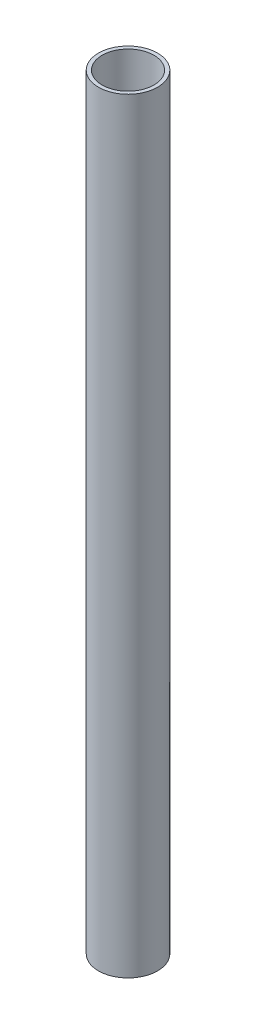
ISO-10303-21;
HEADER;
FILE_DESCRIPTION(('STEP AP214'),'2;1');
FILE_NAME('part.step','',(''),(''),'','','');
FILE_SCHEMA(('AUTOMOTIVE_DESIGN { 1 0 10303 214 1 1 1 1 }'));
ENDSEC;
DATA;
#1=APPLICATION_CONTEXT('core data for automotive mechanical design processes');
#2=APPLICATION_PROTOCOL_DEFINITION('international standard','automotive_design',2000,#1);
#3=PRODUCT_CONTEXT('',#1,'mechanical');
#4=PRODUCT('Part','Part','',(#3));
#5=PRODUCT_RELATED_PRODUCT_CATEGORY('part','',(#4));
#6=PRODUCT_DEFINITION_FORMATION('','',#4);
#7=PRODUCT_DEFINITION_CONTEXT('part definition',#1,'design');
#8=PRODUCT_DEFINITION('design','',#6,#7);
#9=PRODUCT_DEFINITION_SHAPE('','',#8);
#10=(LENGTH_UNIT() NAMED_UNIT(*) SI_UNIT(.MILLI.,.METRE.));
#11=(NAMED_UNIT(*) PLANE_ANGLE_UNIT() SI_UNIT($,.RADIAN.));
#12=(NAMED_UNIT(*) SI_UNIT($,.STERADIAN.) SOLID_ANGLE_UNIT());
#13=UNCERTAINTY_MEASURE_WITH_UNIT(LENGTH_MEASURE(1.E-05),#10,'distance_accuracy_value','');
#14=(GEOMETRIC_REPRESENTATION_CONTEXT(3) GLOBAL_UNCERTAINTY_ASSIGNED_CONTEXT((#13)) GLOBAL_UNIT_ASSIGNED_CONTEXT((#10,
#11,#12)) REPRESENTATION_CONTEXT('',''));
#15=CARTESIAN_POINT('',(0.,0.,0.));
#16=DIRECTION('',(0.,0.,1.));
#17=DIRECTION('',(1.,0.,0.));
#18=AXIS2_PLACEMENT_3D('',#15,#16,#17);
#19=CARTESIAN_POINT('',(0.,207.,0.));
#20=DIRECTION('',(0.,1.,0.));
#21=DIRECTION('',(0.,0.,1.));
#22=AXIS2_PLACEMENT_3D('',#19,#20,#21);
#23=PLANE('',#22);
#24=CARTESIAN_POINT('',(0.,207.,0.));
#25=DIRECTION('',(0.,1.,0.));
#26=DIRECTION('',(0.,0.,1.));
#27=AXIS2_PLACEMENT_3D('',#24,#25,#26);
#28=CIRCLE('',#27,8.);
#29=CARTESIAN_POINT('',(0.,207.,-8.));
#30=VERTEX_POINT('',#29);
#31=EDGE_CURVE('E10',#30,#30,#28,.T.);
#32=ORIENTED_EDGE('',*,*,#31,.T.);
#33=EDGE_LOOP('',(#32));
#34=FACE_BOUND('',#33,.T.);
#35=CARTESIAN_POINT('',(0.,207.,0.));
#36=DIRECTION('',(0.,1.,0.));
#37=DIRECTION('',(0.,0.,1.));
#38=AXIS2_PLACEMENT_3D('',#35,#36,#37);
#39=CIRCLE('',#38,7.);
#40=CARTESIAN_POINT('',(0.,207.,-7.));
#41=VERTEX_POINT('',#40);
#42=EDGE_CURVE('E52',#41,#41,#39,.T.);
#43=ORIENTED_EDGE('',*,*,#42,.F.);
#44=EDGE_LOOP('',(#43));
#45=FACE_BOUND('',#44,.T.);
#46=ADVANCED_FACE('F39',(#34,#45),#23,.T.);
#47=CARTESIAN_POINT('',(0.,0.,0.));
#48=DIRECTION('',(0.,1.,0.));
#49=DIRECTION('',(0.,0.,1.));
#50=AXIS2_PLACEMENT_3D('',#47,#48,#49);
#51=PLANE('',#50);
#52=CARTESIAN_POINT('',(0.,0.,0.));
#53=DIRECTION('',(0.,1.,0.));
#54=DIRECTION('',(0.,0.,1.));
#55=AXIS2_PLACEMENT_3D('',#52,#53,#54);
#56=CIRCLE('',#55,8.);
#57=CARTESIAN_POINT('',(0.,0.,-8.));
#58=VERTEX_POINT('',#57);
#59=EDGE_CURVE('E43',#58,#58,#56,.T.);
#60=ORIENTED_EDGE('',*,*,#59,.F.);
#61=EDGE_LOOP('',(#60));
#62=FACE_BOUND('',#61,.T.);
#63=CARTESIAN_POINT('',(0.,0.,0.));
#64=DIRECTION('',(0.,1.,0.));
#65=DIRECTION('',(0.,0.,1.));
#66=AXIS2_PLACEMENT_3D('',#63,#64,#65);
#67=CIRCLE('',#66,7.);
#68=CARTESIAN_POINT('',(0.,0.,-7.));
#69=VERTEX_POINT('',#68);
#70=EDGE_CURVE('E54',#69,#69,#67,.T.);
#71=ORIENTED_EDGE('',*,*,#70,.T.);
#72=EDGE_LOOP('',(#71));
#73=FACE_BOUND('',#72,.T.);
#74=ADVANCED_FACE('F66',(#62,#73),#51,.F.);
#75=CARTESIAN_POINT('',(0.,207.,0.));
#76=DIRECTION('',(0.,-1.,0.));
#77=DIRECTION('',(0.,0.,-1.));
#78=AXIS2_PLACEMENT_3D('',#75,#76,#77);
#79=CYLINDRICAL_SURFACE('',#78,8.);
#80=CARTESIAN_POINT('',(0.,207.,-8.));
#81=CARTESIAN_POINT('',(0.,204.84375,-8.));
#82=CARTESIAN_POINT('',(0.,202.6875,-8.));
#83=CARTESIAN_POINT('',(0.,198.375,-8.));
#84=CARTESIAN_POINT('',(0.,196.21875,-8.));
#85=CARTESIAN_POINT('',(0.,191.90625,-8.));
#86=CARTESIAN_POINT('',(0.,189.75,-8.));
#87=CARTESIAN_POINT('',(0.,185.4375,-8.));
#88=CARTESIAN_POINT('',(0.,183.28125,-8.));
#89=CARTESIAN_POINT('',(0.,178.96875,-8.));
#90=CARTESIAN_POINT('',(0.,176.8125,-8.));
#91=CARTESIAN_POINT('',(0.,172.5,-8.));
#92=CARTESIAN_POINT('',(0.,170.34375,-8.));
#93=CARTESIAN_POINT('',(0.,166.03125,-8.));
#94=CARTESIAN_POINT('',(0.,163.875,-8.));
#95=CARTESIAN_POINT('',(0.,159.5625,-8.));
#96=CARTESIAN_POINT('',(0.,157.40625,-8.));
#97=CARTESIAN_POINT('',(0.,153.09375,-8.));
#98=CARTESIAN_POINT('',(0.,150.9375,-8.));
#99=CARTESIAN_POINT('',(0.,146.625,-8.));
#100=CARTESIAN_POINT('',(0.,144.46875,-8.));
#101=CARTESIAN_POINT('',(0.,140.15625,-8.));
#102=CARTESIAN_POINT('',(0.,138.,-8.));
#103=CARTESIAN_POINT('',(0.,133.6875,-8.));
#104=CARTESIAN_POINT('',(0.,131.53125,-8.));
#105=CARTESIAN_POINT('',(0.,127.21875,-8.));
#106=CARTESIAN_POINT('',(0.,125.0625,-8.));
#107=CARTESIAN_POINT('',(0.,120.75,-8.));
#108=CARTESIAN_POINT('',(0.,118.59375,-8.));
#109=CARTESIAN_POINT('',(0.,114.28125,-8.));
#110=CARTESIAN_POINT('',(0.,112.125,-8.));
#111=CARTESIAN_POINT('',(0.,107.8125,-8.));
#112=CARTESIAN_POINT('',(0.,105.65625,-8.));
#113=CARTESIAN_POINT('',(0.,101.34375,-8.));
#114=CARTESIAN_POINT('',(0.,99.1875,-8.));
#115=CARTESIAN_POINT('',(0.,94.875,-8.));
#116=CARTESIAN_POINT('',(0.,92.71875,-8.));
#117=CARTESIAN_POINT('',(0.,88.40625,-8.));
#118=CARTESIAN_POINT('',(0.,86.25,-8.));
#119=CARTESIAN_POINT('',(0.,81.9375,-8.));
#120=CARTESIAN_POINT('',(0.,79.78125,-8.));
#121=CARTESIAN_POINT('',(0.,75.46875,-8.));
#122=CARTESIAN_POINT('',(0.,73.3125,-8.));
#123=CARTESIAN_POINT('',(0.,69.,-8.));
#124=CARTESIAN_POINT('',(0.,66.84375,-8.));
#125=CARTESIAN_POINT('',(0.,62.53125,-8.));
#126=CARTESIAN_POINT('',(0.,60.375,-8.));
#127=CARTESIAN_POINT('',(0.,56.0625,-8.));
#128=CARTESIAN_POINT('',(0.,53.90625,-8.));
#129=CARTESIAN_POINT('',(0.,49.59375,-8.));
#130=CARTESIAN_POINT('',(0.,47.4375,-8.));
#131=CARTESIAN_POINT('',(0.,43.125,-8.));
#132=CARTESIAN_POINT('',(0.,40.96875,-8.));
#133=CARTESIAN_POINT('',(0.,36.65625,-8.));
#134=CARTESIAN_POINT('',(0.,34.5,-8.));
#135=CARTESIAN_POINT('',(0.,30.1875,-8.));
#136=CARTESIAN_POINT('',(0.,28.03125,-8.));
#137=CARTESIAN_POINT('',(0.,23.71875,-8.));
#138=CARTESIAN_POINT('',(0.,21.5625,-8.));
#139=CARTESIAN_POINT('',(0.,17.25,-8.));
#140=CARTESIAN_POINT('',(0.,15.09375,-8.));
#141=CARTESIAN_POINT('',(0.,10.78125,-8.));
#142=CARTESIAN_POINT('',(0.,8.62499999999997,-8.));
#143=CARTESIAN_POINT('',(0.,4.31249999999997,-8.));
#144=CARTESIAN_POINT('',(0.,2.15624999999997,-8.));
#145=CARTESIAN_POINT('',(0.,0.,-8.));
#146=B_SPLINE_CURVE_WITH_KNOTS('',3,(#80,#81,#82,#83,#84,#85,#86,#87,#88,#89,#90,#91,#92,#93,
#94,#95,#96,#97,#98,#99,#100,#101,#102,#103,#104,#105,#106,#107,#108,#109,#110,#111,#112,#113,
#114,#115,#116,#117,#118,#119,#120,#121,#122,#123,#124,#125,#126,#127,#128,#129,#130,#131,#132,
#133,#134,#135,#136,#137,#138,#139,#140,#141,#142,#143,#144,#145),.UNSPECIFIED.,.F.,.F.,(4,2,2,
2,2,2,2,2,2,2,2,2,2,2,2,2,2,2,2,2,2,2,2,2,2,2,2,2,2,2,2,2,4),(0.,6.46875000000002,12.9375,
19.40625,25.875,32.34375,38.8125,45.28125,51.75,58.21875,64.6875,71.15625,77.625,84.09375,
90.5625,97.03125,103.5,109.96875,116.4375,122.90625,129.375,135.84375,142.3125,148.78125,155.25,
161.71875,168.1875,174.65625,181.125,187.59375,194.0625,200.53125,207.),.UNSPECIFIED.);
#147=EDGE_CURVE('BSEAM41',#30,#58,#146,.T.);
#148=ORIENTED_EDGE('',*,*,#31,.F.);
#149=ORIENTED_EDGE('',*,*,#59,.T.);
#150=ORIENTED_EDGE('',*,*,#147,.T.);
#151=ORIENTED_EDGE('',*,*,#147,.F.);
#152=EDGE_LOOP('',(#148,#150,#149,#151));
#153=FACE_BOUND('',#152,.T.);
#154=ADVANCED_FACE('F41',(#153),#79,.T.);
#155=CARTESIAN_POINT('',(0.,207.,0.));
#156=DIRECTION('',(0.,-1.,0.));
#157=DIRECTION('',(0.,0.,-1.));
#158=AXIS2_PLACEMENT_3D('',#155,#156,#157);
#159=CYLINDRICAL_SURFACE('',#158,7.);
#160=CARTESIAN_POINT('',(0.,207.,-7.));
#161=CARTESIAN_POINT('',(0.,204.84375,-7.));
#162=CARTESIAN_POINT('',(0.,202.6875,-7.));
#163=CARTESIAN_POINT('',(0.,198.375,-7.));
#164=CARTESIAN_POINT('',(0.,196.21875,-7.));
#165=CARTESIAN_POINT('',(0.,191.90625,-7.));
#166=CARTESIAN_POINT('',(0.,189.75,-7.));
#167=CARTESIAN_POINT('',(0.,185.4375,-7.));
#168=CARTESIAN_POINT('',(0.,183.28125,-7.));
#169=CARTESIAN_POINT('',(0.,178.96875,-7.));
#170=CARTESIAN_POINT('',(0.,176.8125,-7.));
#171=CARTESIAN_POINT('',(0.,172.5,-7.));
#172=CARTESIAN_POINT('',(0.,170.34375,-7.));
#173=CARTESIAN_POINT('',(0.,166.03125,-7.));
#174=CARTESIAN_POINT('',(0.,163.875,-7.));
#175=CARTESIAN_POINT('',(0.,159.5625,-7.));
#176=CARTESIAN_POINT('',(0.,157.40625,-7.));
#177=CARTESIAN_POINT('',(0.,153.09375,-7.));
#178=CARTESIAN_POINT('',(0.,150.9375,-7.));
#179=CARTESIAN_POINT('',(0.,146.625,-7.));
#180=CARTESIAN_POINT('',(0.,144.46875,-7.));
#181=CARTESIAN_POINT('',(0.,140.15625,-7.));
#182=CARTESIAN_POINT('',(0.,138.,-7.));
#183=CARTESIAN_POINT('',(0.,133.6875,-7.));
#184=CARTESIAN_POINT('',(0.,131.53125,-7.));
#185=CARTESIAN_POINT('',(0.,127.21875,-7.));
#186=CARTESIAN_POINT('',(0.,125.0625,-7.));
#187=CARTESIAN_POINT('',(0.,120.75,-7.));
#188=CARTESIAN_POINT('',(0.,118.59375,-7.));
#189=CARTESIAN_POINT('',(0.,114.28125,-7.));
#190=CARTESIAN_POINT('',(0.,112.125,-7.));
#191=CARTESIAN_POINT('',(0.,107.8125,-7.));
#192=CARTESIAN_POINT('',(0.,105.65625,-7.));
#193=CARTESIAN_POINT('',(0.,101.34375,-7.));
#194=CARTESIAN_POINT('',(0.,99.1875,-7.));
#195=CARTESIAN_POINT('',(0.,94.875,-7.));
#196=CARTESIAN_POINT('',(0.,92.71875,-7.));
#197=CARTESIAN_POINT('',(0.,88.40625,-7.));
#198=CARTESIAN_POINT('',(0.,86.25,-7.));
#199=CARTESIAN_POINT('',(0.,81.9375,-7.));
#200=CARTESIAN_POINT('',(0.,79.78125,-7.));
#201=CARTESIAN_POINT('',(0.,75.46875,-7.));
#202=CARTESIAN_POINT('',(0.,73.3125,-7.));
#203=CARTESIAN_POINT('',(0.,69.,-7.));
#204=CARTESIAN_POINT('',(0.,66.84375,-7.));
#205=CARTESIAN_POINT('',(0.,62.53125,-7.));
#206=CARTESIAN_POINT('',(0.,60.375,-7.));
#207=CARTESIAN_POINT('',(0.,56.0625,-7.));
#208=CARTESIAN_POINT('',(0.,53.90625,-7.));
#209=CARTESIAN_POINT('',(0.,49.59375,-7.));
#210=CARTESIAN_POINT('',(0.,47.4375,-7.));
#211=CARTESIAN_POINT('',(0.,43.125,-7.));
#212=CARTESIAN_POINT('',(0.,40.96875,-7.));
#213=CARTESIAN_POINT('',(0.,36.65625,-7.));
#214=CARTESIAN_POINT('',(0.,34.5,-7.));
#215=CARTESIAN_POINT('',(0.,30.1875,-7.));
#216=CARTESIAN_POINT('',(0.,28.03125,-7.));
#217=CARTESIAN_POINT('',(0.,23.71875,-7.));
#218=CARTESIAN_POINT('',(0.,21.5625,-7.));
#219=CARTESIAN_POINT('',(0.,17.25,-7.));
#220=CARTESIAN_POINT('',(0.,15.09375,-7.));
#221=CARTESIAN_POINT('',(0.,10.78125,-7.));
#222=CARTESIAN_POINT('',(0.,8.62499999999997,-7.));
#223=CARTESIAN_POINT('',(0.,4.31249999999997,-7.));
#224=CARTESIAN_POINT('',(0.,2.15624999999997,-7.));
#225=CARTESIAN_POINT('',(0.,0.,-7.));
#226=B_SPLINE_CURVE_WITH_KNOTS('',3,(#160,#161,#162,#163,#164,#165,#166,#167,#168,#169,#170,
#171,#172,#173,#174,#175,#176,#177,#178,#179,#180,#181,#182,#183,#184,#185,#186,#187,#188,#189,
#190,#191,#192,#193,#194,#195,#196,#197,#198,#199,#200,#201,#202,#203,#204,#205,#206,#207,#208,
#209,#210,#211,#212,#213,#214,#215,#216,#217,#218,#219,#220,#221,#222,#223,#224,#225),
.UNSPECIFIED.,.F.,.F.,(4,2,2,2,2,2,2,2,2,2,2,2,2,2,2,2,2,2,2,2,2,2,2,2,2,2,2,2,2,2,2,2,4),(0.,
6.46875000000002,12.9375,19.40625,25.875,32.34375,38.8125,45.28125,51.75,58.21875,64.6875,
71.15625,77.625,84.09375,90.5625,97.03125,103.5,109.96875,116.4375,122.90625,129.375,135.84375,
142.3125,148.78125,155.25,161.71875,168.1875,174.65625,181.125,187.59375,194.0625,200.53125,
207.),.UNSPECIFIED.);
#227=EDGE_CURVE('BSEAM62',#41,#69,#226,.T.);
#228=ORIENTED_EDGE('',*,*,#42,.T.);
#229=ORIENTED_EDGE('',*,*,#70,.F.);
#230=ORIENTED_EDGE('',*,*,#227,.T.);
#231=ORIENTED_EDGE('',*,*,#227,.F.);
#232=EDGE_LOOP('',(#228,#230,#229,#231));
#233=FACE_BOUND('',#232,.T.);
#234=ADVANCED_FACE('F62',(#233),#159,.F.);
#235=CLOSED_SHELL('',(#46,#74,#154,#234));
#236=MANIFOLD_SOLID_BREP('B2',#235);
#237=ADVANCED_BREP_SHAPE_REPRESENTATION('',(#18,#236),#14);
#238=SHAPE_DEFINITION_REPRESENTATION(#9,#237);
ENDSEC;
END-ISO-10303-21;
